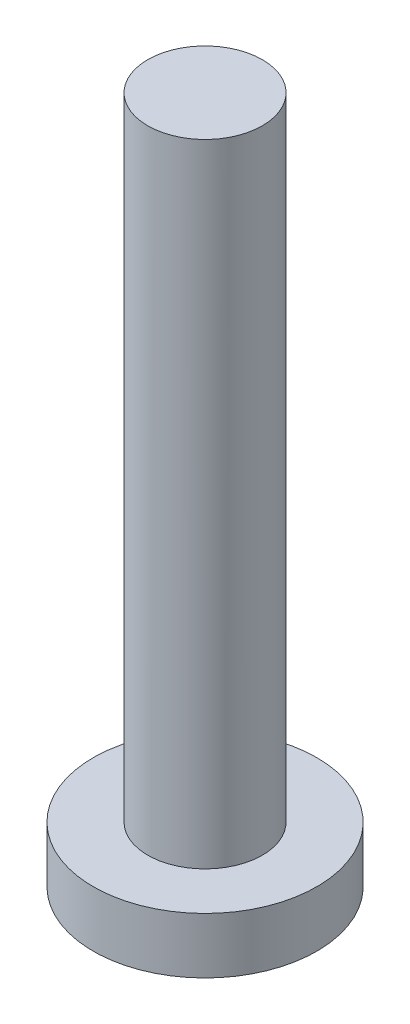
ISO-10303-21;
HEADER;
FILE_DESCRIPTION(('STEP AP214'),'2;1');
FILE_NAME('part.step','',(''),(''),'','','');
FILE_SCHEMA(('AUTOMOTIVE_DESIGN { 1 0 10303 214 1 1 1 1 }'));
ENDSEC;
DATA;
#1=APPLICATION_CONTEXT('core data for automotive mechanical design processes');
#2=APPLICATION_PROTOCOL_DEFINITION('international standard','automotive_design',2000,#1);
#3=PRODUCT_CONTEXT('',#1,'mechanical');
#4=PRODUCT('Part','Part','',(#3));
#5=PRODUCT_RELATED_PRODUCT_CATEGORY('part','',(#4));
#6=PRODUCT_DEFINITION_FORMATION('','',#4);
#7=PRODUCT_DEFINITION_CONTEXT('part definition',#1,'design');
#8=PRODUCT_DEFINITION('design','',#6,#7);
#9=PRODUCT_DEFINITION_SHAPE('','',#8);
#10=(LENGTH_UNIT() NAMED_UNIT(*) SI_UNIT(.MILLI.,.METRE.));
#11=(NAMED_UNIT(*) PLANE_ANGLE_UNIT() SI_UNIT($,.RADIAN.));
#12=(NAMED_UNIT(*) SI_UNIT($,.STERADIAN.) SOLID_ANGLE_UNIT());
#13=UNCERTAINTY_MEASURE_WITH_UNIT(LENGTH_MEASURE(1.E-05),#10,'distance_accuracy_value','');
#14=(GEOMETRIC_REPRESENTATION_CONTEXT(3) GLOBAL_UNCERTAINTY_ASSIGNED_CONTEXT((#13)) GLOBAL_UNIT_ASSIGNED_CONTEXT((#10,
#11,#12)) REPRESENTATION_CONTEXT('',''));
#15=CARTESIAN_POINT('',(0.,0.,0.));
#16=DIRECTION('',(0.,0.,1.));
#17=DIRECTION('',(1.,0.,0.));
#18=AXIS2_PLACEMENT_3D('',#15,#16,#17);
#19=CARTESIAN_POINT('',(0.,11.3,0.));
#20=DIRECTION('',(0.,-1.,0.));
#21=DIRECTION('',(0.,0.,-1.));
#22=AXIS2_PLACEMENT_3D('',#19,#20,#21);
#23=CYLINDRICAL_SURFACE('',#22,1.025);
#24=CARTESIAN_POINT('',(0.,11.3,0.));
#25=DIRECTION('',(0.,1.,0.));
#26=DIRECTION('',(0.,0.,1.));
#27=AXIS2_PLACEMENT_3D('',#24,#25,#26);
#28=CIRCLE('',#27,1.025);
#29=CARTESIAN_POINT('',(0.,11.3,1.025));
#30=VERTEX_POINT('',#29);
#31=EDGE_CURVE('E10',#30,#30,#28,.T.);
#32=ORIENTED_EDGE('',*,*,#31,.F.);
#33=EDGE_LOOP('',(#32));
#34=FACE_BOUND('',#33,.T.);
#35=CARTESIAN_POINT('',(0.,0.,0.));
#36=DIRECTION('',(0.,-1.,0.));
#37=DIRECTION('',(0.,0.,-1.));
#38=AXIS2_PLACEMENT_3D('',#35,#36,#37);
#39=CIRCLE('',#38,1.025);
#40=CARTESIAN_POINT('',(0.,0.,-1.025));
#41=VERTEX_POINT('',#40);
#42=EDGE_CURVE('E37',#41,#41,#39,.T.);
#43=ORIENTED_EDGE('',*,*,#42,.F.);
#44=EDGE_LOOP('',(#43));
#45=FACE_BOUND('',#44,.T.);
#46=ADVANCED_FACE('F31',(#34,#45),#23,.T.);
#47=CARTESIAN_POINT('',(0.,11.3,0.));
#48=DIRECTION('',(0.,1.,0.));
#49=DIRECTION('',(0.,0.,1.));
#50=AXIS2_PLACEMENT_3D('',#47,#48,#49);
#51=PLANE('',#50);
#52=ORIENTED_EDGE('',*,*,#31,.T.);
#53=EDGE_LOOP('',(#52));
#54=FACE_BOUND('',#53,.T.);
#55=ADVANCED_FACE('F64',(#54),#51,.T.);
#56=CARTESIAN_POINT('',(0.,-1.,0.));
#57=DIRECTION('',(0.,1.,0.));
#58=DIRECTION('',(0.,0.,1.));
#59=AXIS2_PLACEMENT_3D('',#56,#57,#58);
#60=CYLINDRICAL_SURFACE('',#59,2.);
#61=CARTESIAN_POINT('',(0.,-1.,0.));
#62=DIRECTION('',(0.,-1.,0.));
#63=DIRECTION('',(0.,0.,-1.));
#64=AXIS2_PLACEMENT_3D('',#61,#62,#63);
#65=CIRCLE('',#64,2.);
#66=CARTESIAN_POINT('',(0.,-1.,-2.));
#67=VERTEX_POINT('',#66);
#68=EDGE_CURVE('E41',#67,#67,#65,.T.);
#69=ORIENTED_EDGE('',*,*,#68,.F.);
#70=EDGE_LOOP('',(#69));
#71=FACE_BOUND('',#70,.T.);
#72=CARTESIAN_POINT('',(0.,0.,0.));
#73=DIRECTION('',(0.,-1.,0.));
#74=DIRECTION('',(0.,0.,-1.));
#75=AXIS2_PLACEMENT_3D('',#72,#73,#74);
#76=CIRCLE('',#75,2.);
#77=CARTESIAN_POINT('',(0.,0.,-2.));
#78=VERTEX_POINT('',#77);
#79=EDGE_CURVE('E45',#78,#78,#76,.T.);
#80=ORIENTED_EDGE('',*,*,#79,.T.);
#81=EDGE_LOOP('',(#80));
#82=FACE_BOUND('',#81,.T.);
#83=ADVANCED_FACE('F51',(#71,#82),#60,.T.);
#84=CARTESIAN_POINT('',(0.,-1.,0.));
#85=DIRECTION('',(0.,-1.,0.));
#86=DIRECTION('',(0.,0.,-1.));
#87=AXIS2_PLACEMENT_3D('',#84,#85,#86);
#88=PLANE('',#87);
#89=ORIENTED_EDGE('',*,*,#68,.T.);
#90=EDGE_LOOP('',(#89));
#91=FACE_BOUND('',#90,.T.);
#92=ADVANCED_FACE('F55',(#91),#88,.T.);
#93=CARTESIAN_POINT('',(0.,0.,0.));
#94=DIRECTION('',(0.,-1.,0.));
#95=DIRECTION('',(0.,0.,-1.));
#96=AXIS2_PLACEMENT_3D('',#93,#94,#95);
#97=PLANE('',#96);
#98=ORIENTED_EDGE('',*,*,#42,.T.);
#99=EDGE_LOOP('',(#98));
#100=FACE_BOUND('',#99,.T.);
#101=ORIENTED_EDGE('',*,*,#79,.F.);
#102=EDGE_LOOP('',(#101));
#103=FACE_BOUND('',#102,.T.);
#104=ADVANCED_FACE('F53',(#100,#103),#97,.F.);
#105=CLOSED_SHELL('',(#46,#55,#83,#92,#104));
#106=MANIFOLD_SOLID_BREP('B2',#105);
#107=ADVANCED_BREP_SHAPE_REPRESENTATION('',(#18,#106),#14);
#108=SHAPE_DEFINITION_REPRESENTATION(#9,#107);
ENDSEC;
END-ISO-10303-21;
